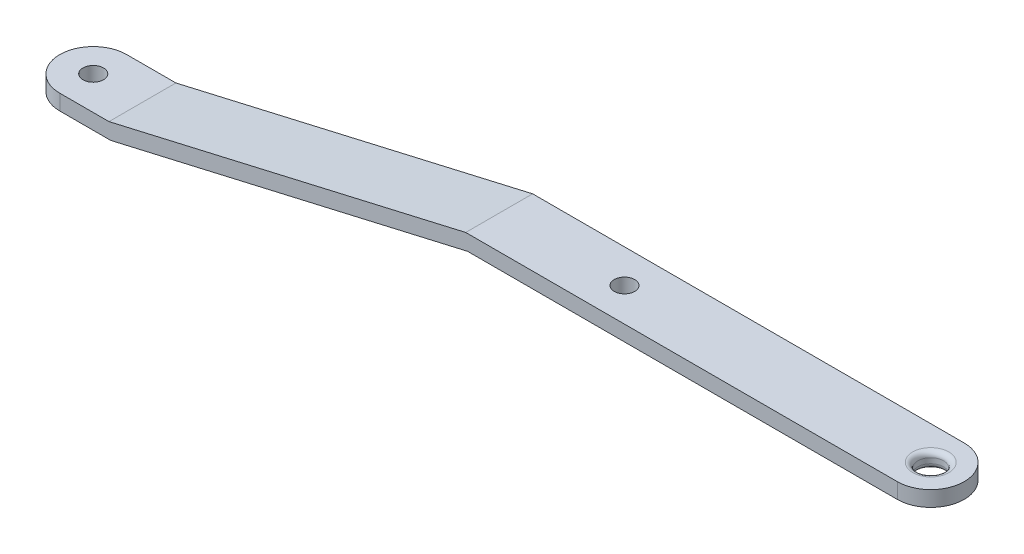
ISO-10303-21;
HEADER;
FILE_DESCRIPTION(('STEP AP214'),'2;1');
FILE_NAME('part.step','',(''),(''),'','','');
FILE_SCHEMA(('AUTOMOTIVE_DESIGN { 1 0 10303 214 1 1 1 1 }'));
ENDSEC;
DATA;
#1=APPLICATION_CONTEXT('core data for automotive mechanical design processes');
#2=APPLICATION_PROTOCOL_DEFINITION('international standard','automotive_design',2000,#1);
#3=PRODUCT_CONTEXT('',#1,'mechanical');
#4=PRODUCT('Part','Part','',(#3));
#5=PRODUCT_RELATED_PRODUCT_CATEGORY('part','',(#4));
#6=PRODUCT_DEFINITION_FORMATION('','',#4);
#7=PRODUCT_DEFINITION_CONTEXT('part definition',#1,'design');
#8=PRODUCT_DEFINITION('design','',#6,#7);
#9=PRODUCT_DEFINITION_SHAPE('','',#8);
#10=(LENGTH_UNIT() NAMED_UNIT(*) SI_UNIT(.MILLI.,.METRE.));
#11=(NAMED_UNIT(*) PLANE_ANGLE_UNIT() SI_UNIT($,.RADIAN.));
#12=(NAMED_UNIT(*) SI_UNIT($,.STERADIAN.) SOLID_ANGLE_UNIT());
#13=UNCERTAINTY_MEASURE_WITH_UNIT(LENGTH_MEASURE(1.E-05),#10,'distance_accuracy_value','');
#14=(GEOMETRIC_REPRESENTATION_CONTEXT(3) GLOBAL_UNCERTAINTY_ASSIGNED_CONTEXT((#13)) GLOBAL_UNIT_ASSIGNED_CONTEXT((#10,
#11,#12)) REPRESENTATION_CONTEXT('',''));
#15=CARTESIAN_POINT('',(0.,0.,0.));
#16=DIRECTION('',(0.,0.,1.));
#17=DIRECTION('',(1.,0.,0.));
#18=AXIS2_PLACEMENT_3D('',#15,#16,#17);
#19=CARTESIAN_POINT('',(764.018069942732,95.,32.5));
#20=DIRECTION('',(0.,1.,0.));
#21=DIRECTION('',(0.,0.,1.));
#22=AXIS2_PLACEMENT_3D('',#19,#20,#21);
#23=CYLINDRICAL_SURFACE('',#22,32.5);
#24=DIRECTION('',(0.,1.,0.));
#25=VECTOR('',#24,1.);
#26=CARTESIAN_POINT('',(764.018069942732,0.,0.));
#27=LINE('',#26,#25);
#28=CARTESIAN_POINT('',(764.018069942732,95.,0.));
#29=VERTEX_POINT('',#28);
#30=CARTESIAN_POINT('',(764.018069942732,80.,0.));
#31=VERTEX_POINT('',#30);
#32=EDGE_CURVE('E175',#29,#31,#27,.F.);
#33=ORIENTED_EDGE('',*,*,#32,.F.);
#34=CARTESIAN_POINT('',(764.018069942732,95.,32.5));
#35=DIRECTION('',(0.,-1.,0.));
#36=DIRECTION('',(0.,0.,-1.));
#37=AXIS2_PLACEMENT_3D('',#34,#35,#36);
#38=CIRCLE('',#37,32.5);
#39=CARTESIAN_POINT('',(764.018069942732,95.,65.));
#40=VERTEX_POINT('',#39);
#41=EDGE_CURVE('E62',#40,#29,#38,.F.);
#42=ORIENTED_EDGE('',*,*,#41,.F.);
#43=DIRECTION('',(0.,-1.,0.));
#44=VECTOR('',#43,1.);
#45=CARTESIAN_POINT('',(764.018069942732,95.,65.));
#46=LINE('',#45,#44);
#47=CARTESIAN_POINT('',(764.018069942732,80.,65.));
#48=VERTEX_POINT('',#47);
#49=EDGE_CURVE('E178',#48,#40,#46,.F.);
#50=ORIENTED_EDGE('',*,*,#49,.F.);
#51=CARTESIAN_POINT('',(764.018069942732,80.,32.5));
#52=DIRECTION('',(0.,1.,0.));
#53=DIRECTION('',(0.,0.,1.));
#54=AXIS2_PLACEMENT_3D('',#51,#52,#53);
#55=CIRCLE('',#54,32.5);
#56=EDGE_CURVE('E70',#31,#48,#55,.F.);
#57=ORIENTED_EDGE('',*,*,#56,.F.);
#58=EDGE_LOOP('',(#33,#42,#50,#57));
#59=FACE_BOUND('',#58,.T.);
#60=ADVANCED_FACE('F47',(#59),#23,.T.);
#61=CARTESIAN_POINT('',(-49.5,15.,32.5));
#62=DIRECTION('',(0.,-1.,0.));
#63=DIRECTION('',(0.,0.,-1.));
#64=AXIS2_PLACEMENT_3D('',#61,#62,#63);
#65=CYLINDRICAL_SURFACE('',#64,32.5);
#66=DIRECTION('',(0.,1.,0.));
#67=VECTOR('',#66,1.);
#68=CARTESIAN_POINT('',(-49.5,15.,65.));
#69=LINE('',#68,#67);
#70=CARTESIAN_POINT('',(-49.5,15.,65.));
#71=VERTEX_POINT('',#70);
#72=CARTESIAN_POINT('',(-49.5,0.,65.));
#73=VERTEX_POINT('',#72);
#74=EDGE_CURVE('E122',#71,#73,#69,.F.);
#75=ORIENTED_EDGE('',*,*,#74,.F.);
#76=CARTESIAN_POINT('',(-49.5,15.,32.5));
#77=DIRECTION('',(0.,-1.,0.));
#78=DIRECTION('',(0.,0.,-1.));
#79=AXIS2_PLACEMENT_3D('',#76,#77,#78);
#80=CIRCLE('',#79,32.5);
#81=CARTESIAN_POINT('',(-49.5,15.,0.));
#82=VERTEX_POINT('',#81);
#83=EDGE_CURVE('E171',#82,#71,#80,.F.);
#84=ORIENTED_EDGE('',*,*,#83,.F.);
#85=DIRECTION('',(0.,-1.,0.));
#86=VECTOR('',#85,1.);
#87=CARTESIAN_POINT('',(-49.5,0.,0.));
#88=LINE('',#87,#86);
#89=CARTESIAN_POINT('',(-49.5,0.,0.));
#90=VERTEX_POINT('',#89);
#91=EDGE_CURVE('E168',#90,#82,#88,.F.);
#92=ORIENTED_EDGE('',*,*,#91,.F.);
#93=CARTESIAN_POINT('',(-49.5,0.,32.5));
#94=DIRECTION('',(0.,1.,0.));
#95=DIRECTION('',(0.,0.,1.));
#96=AXIS2_PLACEMENT_3D('',#93,#94,#95);
#97=CIRCLE('',#96,32.5);
#98=EDGE_CURVE('E173',#73,#90,#97,.F.);
#99=ORIENTED_EDGE('',*,*,#98,.F.);
#100=EDGE_LOOP('',(#75,#84,#92,#99));
#101=FACE_BOUND('',#100,.T.);
#102=ADVANCED_FACE('F231',(#101),#65,.T.);
#103=CARTESIAN_POINT('',(-82.,0.,65.));
#104=DIRECTION('',(0.,1.,0.));
#105=DIRECTION('',(0.,0.,1.));
#106=AXIS2_PLACEMENT_3D('',#103,#104,#105);
#107=PLANE('',#106);
#108=CARTESIAN_POINT('',(-49.5,0.,32.5));
#109=DIRECTION('',(0.,-1.,0.));
#110=DIRECTION('',(0.,0.,-1.));
#111=AXIS2_PLACEMENT_3D('',#108,#109,#110);
#112=CIRCLE('',#111,10.);
#113=CARTESIAN_POINT('',(-49.5,0.,22.5));
#114=VERTEX_POINT('',#113);
#115=EDGE_CURVE('E189',#114,#114,#112,.T.);
#116=ORIENTED_EDGE('',*,*,#115,.F.);
#117=EDGE_LOOP('',(#116));
#118=FACE_BOUND('',#117,.T.);
#119=DIRECTION('',(1.,0.,0.));
#120=VECTOR('',#119,1.);
#121=CARTESIAN_POINT('',(-82.,0.,65.));
#122=LINE('',#121,#120);
#123=CARTESIAN_POINT('',(0.,0.,65.));
#124=VERTEX_POINT('',#123);
#125=EDGE_CURVE('E113',#73,#124,#122,.T.);
#126=ORIENTED_EDGE('',*,*,#125,.F.);
#127=ORIENTED_EDGE('',*,*,#98,.T.);
#128=DIRECTION('',(1.,0.,0.));
#129=VECTOR('',#128,1.);
#130=CARTESIAN_POINT('',(-82.,0.,0.));
#131=LINE('',#130,#129);
#132=CARTESIAN_POINT('',(0.,0.,0.));
#133=VERTEX_POINT('',#132);
#134=EDGE_CURVE('E130',#90,#133,#131,.T.);
#135=ORIENTED_EDGE('',*,*,#134,.T.);
#136=DIRECTION('',(0.,0.,-1.));
#137=VECTOR('',#136,1.);
#138=CARTESIAN_POINT('',(0.,0.,65.));
#139=LINE('',#138,#137);
#140=EDGE_CURVE('E127',#124,#133,#139,.T.);
#141=ORIENTED_EDGE('',*,*,#140,.F.);
#142=EDGE_LOOP('',(#126,#127,#135,#141));
#143=FACE_BOUND('',#142,.T.);
#144=ADVANCED_FACE('F128',(#118,#143),#107,.F.);
#145=CARTESIAN_POINT('',(0.,0.,65.));
#146=DIRECTION('',(-0.224951054343865,0.974370064785235,0.));
#147=DIRECTION('',(-0.974370064785235,-0.224951054343865,0.));
#148=AXIS2_PLACEMENT_3D('',#145,#146,#147);
#149=PLANE('',#148);
#150=DIRECTION('',(0.974370064785235,0.224951054343865,0.));
#151=VECTOR('',#150,1.);
#152=CARTESIAN_POINT('',(0.,0.,0.));
#153=LINE('',#152,#151);
#154=CARTESIAN_POINT('',(346.518069942732,80.,0.));
#155=VERTEX_POINT('',#154);
#156=EDGE_CURVE('E150',#133,#155,#153,.T.);
#157=ORIENTED_EDGE('',*,*,#156,.T.);
#158=DIRECTION('',(0.,0.,-1.));
#159=VECTOR('',#158,1.);
#160=CARTESIAN_POINT('',(346.518069942732,80.,65.));
#161=LINE('',#160,#159);
#162=CARTESIAN_POINT('',(346.518069942732,80.,65.));
#163=VERTEX_POINT('',#162);
#164=EDGE_CURVE('E133',#163,#155,#161,.T.);
#165=ORIENTED_EDGE('',*,*,#164,.F.);
#166=DIRECTION('',(0.974370064785235,0.224951054343865,0.));
#167=VECTOR('',#166,1.);
#168=CARTESIAN_POINT('',(0.,0.,65.));
#169=LINE('',#168,#167);
#170=EDGE_CURVE('E118',#124,#163,#169,.T.);
#171=ORIENTED_EDGE('',*,*,#170,.F.);
#172=ORIENTED_EDGE('',*,*,#140,.T.);
#173=EDGE_LOOP('',(#157,#165,#171,#172));
#174=FACE_BOUND('',#173,.T.);
#175=ADVANCED_FACE('F135',(#174),#149,.F.);
#176=CARTESIAN_POINT('',(346.518069942732,80.,65.));
#177=DIRECTION('',(0.,1.,0.));
#178=DIRECTION('',(0.,0.,1.));
#179=AXIS2_PLACEMENT_3D('',#176,#177,#178);
#180=PLANE('',#179);
#181=CARTESIAN_POINT('',(764.018069942732,80.,32.5));
#182=DIRECTION('',(0.,1.,0.));
#183=DIRECTION('',(0.,0.,1.));
#184=AXIS2_PLACEMENT_3D('',#181,#182,#183);
#185=CIRCLE('',#184,17.5);
#186=CARTESIAN_POINT('',(764.018069942732,80.,50.));
#187=VERTEX_POINT('',#186);
#188=EDGE_CURVE('E11',#187,#187,#185,.T.);
#189=ORIENTED_EDGE('',*,*,#188,.T.);
#190=EDGE_LOOP('',(#189));
#191=FACE_BOUND('',#190,.T.);
#192=CARTESIAN_POINT('',(466.518069942732,80.,32.5));
#193=DIRECTION('',(0.,-1.,0.));
#194=DIRECTION('',(0.,0.,-1.));
#195=AXIS2_PLACEMENT_3D('',#192,#193,#194);
#196=CIRCLE('',#195,9.99999999999998);
#197=CARTESIAN_POINT('',(466.518069942732,80.,22.5));
#198=VERTEX_POINT('',#197);
#199=EDGE_CURVE('E185',#198,#198,#196,.T.);
#200=ORIENTED_EDGE('',*,*,#199,.F.);
#201=EDGE_LOOP('',(#200));
#202=FACE_BOUND('',#201,.T.);
#203=DIRECTION('',(1.,0.,0.));
#204=VECTOR('',#203,1.);
#205=CARTESIAN_POINT('',(346.518069942732,80.,0.));
#206=LINE('',#205,#204);
#207=EDGE_CURVE('E153',#155,#31,#206,.T.);
#208=ORIENTED_EDGE('',*,*,#207,.T.);
#209=ORIENTED_EDGE('',*,*,#56,.T.);
#210=DIRECTION('',(1.,0.,0.));
#211=VECTOR('',#210,1.);
#212=CARTESIAN_POINT('',(346.518069942732,80.,65.));
#213=LINE('',#212,#211);
#214=EDGE_CURVE('E137',#163,#48,#213,.T.);
#215=ORIENTED_EDGE('',*,*,#214,.F.);
#216=ORIENTED_EDGE('',*,*,#164,.T.);
#217=EDGE_LOOP('',(#208,#209,#215,#216));
#218=FACE_BOUND('',#217,.T.);
#219=ADVANCED_FACE('F209',(#191,#202,#218),#180,.F.);
#220=CARTESIAN_POINT('',(344.809035818207,95.,65.));
#221=DIRECTION('',(0.,-1.,0.));
#222=DIRECTION('',(0.,0.,-1.));
#223=AXIS2_PLACEMENT_3D('',#220,#221,#222);
#224=PLANE('',#223);
#225=CARTESIAN_POINT('',(764.018069942732,95.,32.5));
#226=DIRECTION('',(0.,-1.,0.));
#227=DIRECTION('',(0.,0.,-1.));
#228=AXIS2_PLACEMENT_3D('',#225,#226,#227);
#229=CIRCLE('',#228,17.5);
#230=CARTESIAN_POINT('',(764.018069942732,95.,15.));
#231=VERTEX_POINT('',#230);
#232=EDGE_CURVE('E182',#231,#231,#229,.T.);
#233=ORIENTED_EDGE('',*,*,#232,.T.);
#234=EDGE_LOOP('',(#233));
#235=FACE_BOUND('',#234,.T.);
#236=CARTESIAN_POINT('',(466.518069942732,95.,32.5));
#237=DIRECTION('',(0.,-1.,0.));
#238=DIRECTION('',(0.,0.,-1.));
#239=AXIS2_PLACEMENT_3D('',#236,#237,#238);
#240=CIRCLE('',#239,9.99999999999998);
#241=CARTESIAN_POINT('',(466.518069942732,95.,22.5));
#242=VERTEX_POINT('',#241);
#243=EDGE_CURVE('E151',#242,#242,#240,.T.);
#244=ORIENTED_EDGE('',*,*,#243,.T.);
#245=EDGE_LOOP('',(#244));
#246=FACE_BOUND('',#245,.T.);
#247=DIRECTION('',(-1.,0.,0.));
#248=VECTOR('',#247,1.);
#249=CARTESIAN_POINT('',(344.809035818207,95.,65.));
#250=LINE('',#249,#248);
#251=CARTESIAN_POINT('',(344.809035818207,95.,65.));
#252=VERTEX_POINT('',#251);
#253=EDGE_CURVE('E139',#40,#252,#250,.T.);
#254=ORIENTED_EDGE('',*,*,#253,.F.);
#255=ORIENTED_EDGE('',*,*,#41,.T.);
#256=DIRECTION('',(-1.,0.,0.));
#257=VECTOR('',#256,1.);
#258=CARTESIAN_POINT('',(344.809035818207,95.,0.));
#259=LINE('',#258,#257);
#260=CARTESIAN_POINT('',(344.809035818207,95.,0.));
#261=VERTEX_POINT('',#260);
#262=EDGE_CURVE('E155',#29,#261,#259,.T.);
#263=ORIENTED_EDGE('',*,*,#262,.T.);
#264=DIRECTION('',(0.,0.,-1.));
#265=VECTOR('',#264,1.);
#266=CARTESIAN_POINT('',(344.809035818207,95.,65.));
#267=LINE('',#266,#265);
#268=EDGE_CURVE('E163',#252,#261,#267,.T.);
#269=ORIENTED_EDGE('',*,*,#268,.F.);
#270=EDGE_LOOP('',(#254,#255,#263,#269));
#271=FACE_BOUND('',#270,.T.);
#272=ADVANCED_FACE('F205',(#235,#246,#271),#224,.F.);
#273=CARTESIAN_POINT('',(-1.7090341245247,15.,65.));
#274=DIRECTION('',(0.224951054343865,-0.974370064785235,0.));
#275=DIRECTION('',(0.974370064785235,0.224951054343865,0.));
#276=AXIS2_PLACEMENT_3D('',#273,#274,#275);
#277=PLANE('',#276);
#278=DIRECTION('',(-0.974370064785235,-0.224951054343865,0.));
#279=VECTOR('',#278,1.);
#280=CARTESIAN_POINT('',(-1.7090341245247,15.,0.));
#281=LINE('',#280,#279);
#282=CARTESIAN_POINT('',(-1.7090341245247,15.,0.));
#283=VERTEX_POINT('',#282);
#284=EDGE_CURVE('E157',#261,#283,#281,.T.);
#285=ORIENTED_EDGE('',*,*,#284,.T.);
#286=DIRECTION('',(0.,0.,-1.));
#287=VECTOR('',#286,1.);
#288=CARTESIAN_POINT('',(-1.7090341245247,15.,65.));
#289=LINE('',#288,#287);
#290=CARTESIAN_POINT('',(-1.7090341245247,15.,65.));
#291=VERTEX_POINT('',#290);
#292=EDGE_CURVE('E148',#291,#283,#289,.T.);
#293=ORIENTED_EDGE('',*,*,#292,.F.);
#294=DIRECTION('',(-0.974370064785235,-0.224951054343865,0.));
#295=VECTOR('',#294,1.);
#296=CARTESIAN_POINT('',(-1.7090341245247,15.,65.));
#297=LINE('',#296,#295);
#298=EDGE_CURVE('E144',#252,#291,#297,.T.);
#299=ORIENTED_EDGE('',*,*,#298,.F.);
#300=ORIENTED_EDGE('',*,*,#268,.T.);
#301=EDGE_LOOP('',(#285,#293,#299,#300));
#302=FACE_BOUND('',#301,.T.);
#303=ADVANCED_FACE('F208',(#302),#277,.F.);
#304=CARTESIAN_POINT('',(-82.,15.,65.));
#305=DIRECTION('',(0.,-1.,0.));
#306=DIRECTION('',(0.,0.,-1.));
#307=AXIS2_PLACEMENT_3D('',#304,#305,#306);
#308=PLANE('',#307);
#309=CARTESIAN_POINT('',(-49.5,15.,32.5));
#310=DIRECTION('',(0.,-1.,0.));
#311=DIRECTION('',(0.,0.,-1.));
#312=AXIS2_PLACEMENT_3D('',#309,#310,#311);
#313=CIRCLE('',#312,10.);
#314=CARTESIAN_POINT('',(-49.5,15.,22.5));
#315=VERTEX_POINT('',#314);
#316=EDGE_CURVE('E186',#315,#315,#313,.T.);
#317=ORIENTED_EDGE('',*,*,#316,.T.);
#318=EDGE_LOOP('',(#317));
#319=FACE_BOUND('',#318,.T.);
#320=DIRECTION('',(-1.,0.,0.));
#321=VECTOR('',#320,1.);
#322=CARTESIAN_POINT('',(-82.,15.,0.));
#323=LINE('',#322,#321);
#324=EDGE_CURVE('E124',#283,#82,#323,.T.);
#325=ORIENTED_EDGE('',*,*,#324,.T.);
#326=ORIENTED_EDGE('',*,*,#83,.T.);
#327=DIRECTION('',(-1.,0.,0.));
#328=VECTOR('',#327,1.);
#329=CARTESIAN_POINT('',(-82.,15.,65.));
#330=LINE('',#329,#328);
#331=EDGE_CURVE('E146',#291,#71,#330,.T.);
#332=ORIENTED_EDGE('',*,*,#331,.F.);
#333=ORIENTED_EDGE('',*,*,#292,.T.);
#334=EDGE_LOOP('',(#325,#326,#332,#333));
#335=FACE_BOUND('',#334,.T.);
#336=ADVANCED_FACE('F270',(#319,#335),#308,.F.);
#337=CARTESIAN_POINT('',(0.,0.,65.));
#338=DIRECTION('',(0.,0.,1.));
#339=DIRECTION('',(1.,0.,0.));
#340=AXIS2_PLACEMENT_3D('',#337,#338,#339);
#341=PLANE('',#340);
#342=ORIENTED_EDGE('',*,*,#214,.T.);
#343=ORIENTED_EDGE('',*,*,#49,.T.);
#344=ORIENTED_EDGE('',*,*,#253,.T.);
#345=ORIENTED_EDGE('',*,*,#298,.T.);
#346=ORIENTED_EDGE('',*,*,#331,.T.);
#347=ORIENTED_EDGE('',*,*,#74,.T.);
#348=ORIENTED_EDGE('',*,*,#125,.T.);
#349=ORIENTED_EDGE('',*,*,#170,.T.);
#350=EDGE_LOOP('',(#342,#343,#344,#345,#346,#347,#348,#349));
#351=FACE_BOUND('',#350,.T.);
#352=ADVANCED_FACE('F116',(#351),#341,.T.);
#353=CARTESIAN_POINT('',(0.,0.,0.));
#354=DIRECTION('',(0.,0.,1.));
#355=DIRECTION('',(1.,0.,0.));
#356=AXIS2_PLACEMENT_3D('',#353,#354,#355);
#357=PLANE('',#356);
#358=ORIENTED_EDGE('',*,*,#262,.F.);
#359=ORIENTED_EDGE('',*,*,#32,.T.);
#360=ORIENTED_EDGE('',*,*,#207,.F.);
#361=ORIENTED_EDGE('',*,*,#156,.F.);
#362=ORIENTED_EDGE('',*,*,#134,.F.);
#363=ORIENTED_EDGE('',*,*,#91,.T.);
#364=ORIENTED_EDGE('',*,*,#324,.F.);
#365=ORIENTED_EDGE('',*,*,#284,.F.);
#366=EDGE_LOOP('',(#358,#359,#360,#361,#362,#363,#364,#365));
#367=FACE_BOUND('',#366,.T.);
#368=ADVANCED_FACE('F220',(#367),#357,.F.);
#369=CARTESIAN_POINT('',(466.518069942732,100.,32.5));
#370=DIRECTION('',(0.,-1.,0.));
#371=DIRECTION('',(0.,0.,-1.));
#372=AXIS2_PLACEMENT_3D('',#369,#370,#371);
#373=CYLINDRICAL_SURFACE('',#372,9.99999999999998);
#374=ORIENTED_EDGE('',*,*,#199,.T.);
#375=EDGE_LOOP('',(#374));
#376=FACE_BOUND('',#375,.T.);
#377=ORIENTED_EDGE('',*,*,#243,.F.);
#378=EDGE_LOOP('',(#377));
#379=FACE_BOUND('',#378,.T.);
#380=ADVANCED_FACE('F256',(#376,#379),#373,.F.);
#381=CARTESIAN_POINT('',(-49.5,20.,32.5));
#382=DIRECTION('',(0.,-1.,0.));
#383=DIRECTION('',(0.,0.,-1.));
#384=AXIS2_PLACEMENT_3D('',#381,#382,#383);
#385=CYLINDRICAL_SURFACE('',#384,10.);
#386=ORIENTED_EDGE('',*,*,#115,.T.);
#387=EDGE_LOOP('',(#386));
#388=FACE_BOUND('',#387,.T.);
#389=ORIENTED_EDGE('',*,*,#316,.F.);
#390=EDGE_LOOP('',(#389));
#391=FACE_BOUND('',#390,.T.);
#392=ADVANCED_FACE('F259',(#388,#391),#385,.F.);
#393=CARTESIAN_POINT('',(764.018069942732,100.,32.5));
#394=DIRECTION('',(0.,-1.,0.));
#395=DIRECTION('',(0.,0.,-1.));
#396=AXIS2_PLACEMENT_3D('',#393,#394,#395);
#397=CYLINDRICAL_SURFACE('',#396,12.5);
#398=CARTESIAN_POINT('',(764.018069942732,90.,32.5));
#399=DIRECTION('',(0.,-1.,0.));
#400=DIRECTION('',(0.,0.,-1.));
#401=AXIS2_PLACEMENT_3D('',#398,#399,#400);
#402=CIRCLE('',#401,12.5);
#403=CARTESIAN_POINT('',(764.018069942732,90.,20.));
#404=VERTEX_POINT('',#403);
#405=EDGE_CURVE('E55',#404,#404,#402,.F.);
#406=ORIENTED_EDGE('',*,*,#405,.T.);
#407=EDGE_LOOP('',(#406));
#408=FACE_BOUND('',#407,.T.);
#409=CARTESIAN_POINT('',(764.018069942732,85.,32.5));
#410=DIRECTION('',(0.,1.,0.));
#411=DIRECTION('',(0.,0.,1.));
#412=AXIS2_PLACEMENT_3D('',#409,#410,#411);
#413=CIRCLE('',#412,12.5);
#414=CARTESIAN_POINT('',(764.018069942732,85.,45.));
#415=VERTEX_POINT('',#414);
#416=EDGE_CURVE('E192',#415,#415,#413,.F.);
#417=ORIENTED_EDGE('',*,*,#416,.T.);
#418=EDGE_LOOP('',(#417));
#419=FACE_BOUND('',#418,.T.);
#420=ADVANCED_FACE('F197',(#408,#419),#397,.F.);
#421=CARTESIAN_POINT('',(764.018069942732,90.,32.5));
#422=DIRECTION('',(0.,-1.,0.));
#423=DIRECTION('',(0.,0.,-1.));
#424=AXIS2_PLACEMENT_3D('',#421,#422,#423);
#425=TOROIDAL_SURFACE('',#424,17.5,5.);
#426=ORIENTED_EDGE('',*,*,#405,.F.);
#427=EDGE_LOOP('',(#426));
#428=FACE_BOUND('',#427,.T.);
#429=ORIENTED_EDGE('',*,*,#232,.F.);
#430=EDGE_LOOP('',(#429));
#431=FACE_BOUND('',#430,.T.);
#432=ADVANCED_FACE('F200',(#428,#431),#425,.T.);
#433=CARTESIAN_POINT('',(764.018069942732,85.,32.5));
#434=DIRECTION('',(0.,1.,0.));
#435=DIRECTION('',(0.,0.,1.));
#436=AXIS2_PLACEMENT_3D('',#433,#434,#435);
#437=TOROIDAL_SURFACE('',#436,17.5,5.);
#438=ORIENTED_EDGE('',*,*,#188,.F.);
#439=EDGE_LOOP('',(#438));
#440=FACE_BOUND('',#439,.T.);
#441=ORIENTED_EDGE('',*,*,#416,.F.);
#442=EDGE_LOOP('',(#441));
#443=FACE_BOUND('',#442,.T.);
#444=ADVANCED_FACE('F49',(#440,#443),#437,.T.);
#445=CLOSED_SHELL('',(#60,#102,#144,#175,#219,#272,#303,#336,#352,#368,#380,#392,#420,#432,#444));
#446=MANIFOLD_SOLID_BREP('B2',#445);
#447=ADVANCED_BREP_SHAPE_REPRESENTATION('',(#18,#446),#14);
#448=SHAPE_DEFINITION_REPRESENTATION(#9,#447);
ENDSEC;
END-ISO-10303-21;
